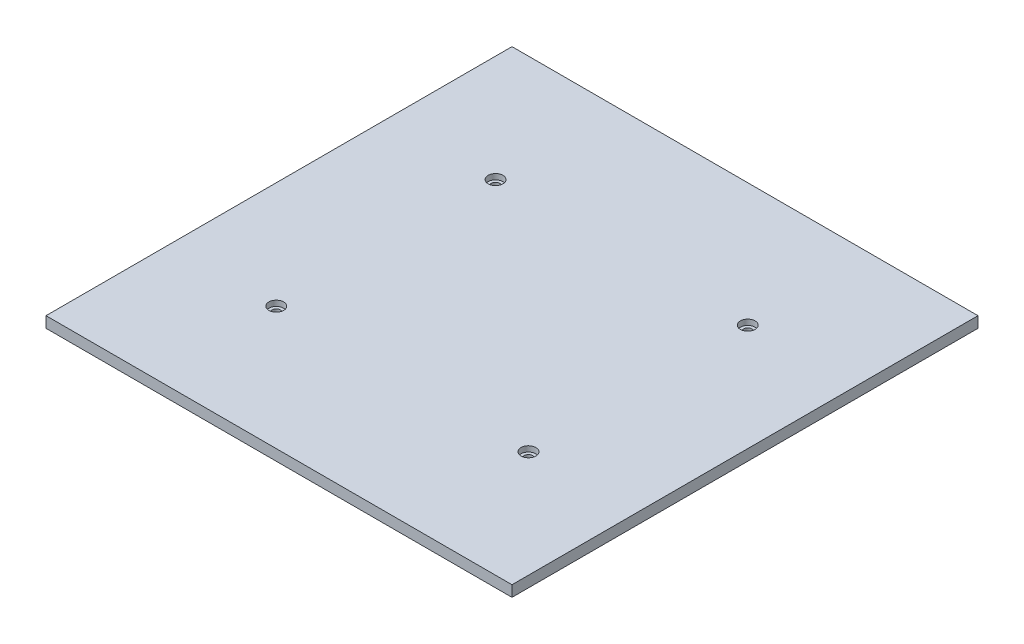
ISO-10303-21;
HEADER;
FILE_DESCRIPTION(('STEP AP214'),'2;1');
FILE_NAME('part.step','',(''),(''),'','','');
FILE_SCHEMA(('AUTOMOTIVE_DESIGN { 1 0 10303 214 1 1 1 1 }'));
ENDSEC;
DATA;
#1=APPLICATION_CONTEXT('core data for automotive mechanical design processes');
#2=APPLICATION_PROTOCOL_DEFINITION('international standard','automotive_design',2000,#1);
#3=PRODUCT_CONTEXT('',#1,'mechanical');
#4=PRODUCT('Part','Part','',(#3));
#5=PRODUCT_RELATED_PRODUCT_CATEGORY('part','',(#4));
#6=PRODUCT_DEFINITION_FORMATION('','',#4);
#7=PRODUCT_DEFINITION_CONTEXT('part definition',#1,'design');
#8=PRODUCT_DEFINITION('design','',#6,#7);
#9=PRODUCT_DEFINITION_SHAPE('','',#8);
#10=(LENGTH_UNIT() NAMED_UNIT(*) SI_UNIT(.MILLI.,.METRE.));
#11=(NAMED_UNIT(*) PLANE_ANGLE_UNIT() SI_UNIT($,.RADIAN.));
#12=(NAMED_UNIT(*) SI_UNIT($,.STERADIAN.) SOLID_ANGLE_UNIT());
#13=UNCERTAINTY_MEASURE_WITH_UNIT(LENGTH_MEASURE(1.E-05),#10,'distance_accuracy_value','');
#14=(GEOMETRIC_REPRESENTATION_CONTEXT(3) GLOBAL_UNCERTAINTY_ASSIGNED_CONTEXT((#13)) GLOBAL_UNIT_ASSIGNED_CONTEXT((#10,
#11,#12)) REPRESENTATION_CONTEXT('',''));
#15=CARTESIAN_POINT('',(0.,0.,0.));
#16=DIRECTION('',(0.,0.,1.));
#17=DIRECTION('',(1.,0.,0.));
#18=AXIS2_PLACEMENT_3D('',#15,#16,#17);
#19=CARTESIAN_POINT('',(-46.,-0.00100000000000013,40.));
#20=DIRECTION('',(0.,1.,0.));
#21=DIRECTION('',(0.,0.,1.));
#22=AXIS2_PLACEMENT_3D('',#19,#20,#21);
#23=CYLINDRICAL_SURFACE('',#22,1.6);
#24=CARTESIAN_POINT('',(-46.,0.,40.));
#25=DIRECTION('',(0.,-1.,0.));
#26=DIRECTION('',(0.,0.,-1.));
#27=AXIS2_PLACEMENT_3D('',#24,#25,#26);
#28=CIRCLE('',#27,1.6);
#29=CARTESIAN_POINT('',(-46.,0.,38.4));
#30=VERTEX_POINT('',#29);
#31=EDGE_CURVE('E106',#30,#30,#28,.F.);
#32=ORIENTED_EDGE('',*,*,#31,.F.);
#33=EDGE_LOOP('',(#32));
#34=FACE_BOUND('',#33,.T.);
#35=CARTESIAN_POINT('',(-46.,2.,40.));
#36=DIRECTION('',(0.,1.,0.));
#37=DIRECTION('',(0.,0.,1.));
#38=AXIS2_PLACEMENT_3D('',#35,#36,#37);
#39=CIRCLE('',#38,1.6);
#40=CARTESIAN_POINT('',(-46.,2.,41.6));
#41=VERTEX_POINT('',#40);
#42=EDGE_CURVE('E160',#41,#41,#39,.T.);
#43=ORIENTED_EDGE('',*,*,#42,.T.);
#44=EDGE_LOOP('',(#43));
#45=FACE_BOUND('',#44,.T.);
#46=ADVANCED_FACE('F39',(#34,#45),#23,.F.);
#47=CARTESIAN_POINT('',(46.,-0.00100000000000013,-40.));
#48=DIRECTION('',(0.,1.,0.));
#49=DIRECTION('',(0.,0.,1.));
#50=AXIS2_PLACEMENT_3D('',#47,#48,#49);
#51=CYLINDRICAL_SURFACE('',#50,1.6);
#52=CARTESIAN_POINT('',(46.,0.,-40.));
#53=DIRECTION('',(0.,-1.,0.));
#54=DIRECTION('',(0.,0.,-1.));
#55=AXIS2_PLACEMENT_3D('',#52,#53,#54);
#56=CIRCLE('',#55,1.6);
#57=CARTESIAN_POINT('',(46.,0.,-41.6));
#58=VERTEX_POINT('',#57);
#59=EDGE_CURVE('E124',#58,#58,#56,.F.);
#60=ORIENTED_EDGE('',*,*,#59,.F.);
#61=EDGE_LOOP('',(#60));
#62=FACE_BOUND('',#61,.T.);
#63=CARTESIAN_POINT('',(46.,2.,-40.));
#64=DIRECTION('',(0.,1.,0.));
#65=DIRECTION('',(0.,0.,1.));
#66=AXIS2_PLACEMENT_3D('',#63,#64,#65);
#67=CIRCLE('',#66,1.6);
#68=CARTESIAN_POINT('',(46.,2.,-38.4));
#69=VERTEX_POINT('',#68);
#70=EDGE_CURVE('E133',#69,#69,#67,.T.);
#71=ORIENTED_EDGE('',*,*,#70,.T.);
#72=EDGE_LOOP('',(#71));
#73=FACE_BOUND('',#72,.T.);
#74=ADVANCED_FACE('F182',(#62,#73),#51,.F.);
#75=CARTESIAN_POINT('',(0.,4.,0.));
#76=DIRECTION('',(0.,-1.,0.));
#77=DIRECTION('',(0.,0.,-1.));
#78=AXIS2_PLACEMENT_3D('',#75,#76,#77);
#79=PLANE('',#78);
#80=CARTESIAN_POINT('',(-46.,4.,-40.));
#81=DIRECTION('',(0.,1.,0.));
#82=DIRECTION('',(0.,0.,-1.));
#83=AXIS2_PLACEMENT_3D('',#80,#81,#82);
#84=CIRCLE('',#83,2.7);
#85=CARTESIAN_POINT('',(-46.,4.,-42.7));
#86=VERTEX_POINT('',#85);
#87=EDGE_CURVE('E150',#86,#86,#84,.T.);
#88=ORIENTED_EDGE('',*,*,#87,.F.);
#89=EDGE_LOOP('',(#88));
#90=FACE_BOUND('',#89,.T.);
#91=CARTESIAN_POINT('',(46.,4.,40.));
#92=DIRECTION('',(0.,1.,0.));
#93=DIRECTION('',(0.,0.,-1.));
#94=AXIS2_PLACEMENT_3D('',#91,#92,#93);
#95=CIRCLE('',#94,2.7);
#96=CARTESIAN_POINT('',(46.,4.,37.3));
#97=VERTEX_POINT('',#96);
#98=EDGE_CURVE('E139',#97,#97,#95,.T.);
#99=ORIENTED_EDGE('',*,*,#98,.F.);
#100=EDGE_LOOP('',(#99));
#101=FACE_BOUND('',#100,.T.);
#102=CARTESIAN_POINT('',(-46.,4.,40.));
#103=DIRECTION('',(0.,1.,0.));
#104=DIRECTION('',(0.,0.,1.));
#105=AXIS2_PLACEMENT_3D('',#102,#103,#104);
#106=CIRCLE('',#105,2.7);
#107=CARTESIAN_POINT('',(-46.,4.,42.7));
#108=VERTEX_POINT('',#107);
#109=EDGE_CURVE('E157',#108,#108,#106,.T.);
#110=ORIENTED_EDGE('',*,*,#109,.F.);
#111=EDGE_LOOP('',(#110));
#112=FACE_BOUND('',#111,.T.);
#113=CARTESIAN_POINT('',(46.,4.,-40.));
#114=DIRECTION('',(0.,1.,0.));
#115=DIRECTION('',(0.,0.,1.));
#116=AXIS2_PLACEMENT_3D('',#113,#114,#115);
#117=CIRCLE('',#116,2.7);
#118=CARTESIAN_POINT('',(46.,4.,-37.3));
#119=VERTEX_POINT('',#118);
#120=EDGE_CURVE('E130',#119,#119,#117,.T.);
#121=ORIENTED_EDGE('',*,*,#120,.F.);
#122=EDGE_LOOP('',(#121));
#123=FACE_BOUND('',#122,.T.);
#124=DIRECTION('',(0.,0.,-1.));
#125=VECTOR('',#124,1.);
#126=CARTESIAN_POINT('',(85.,4.,85.));
#127=LINE('',#126,#125);
#128=CARTESIAN_POINT('',(85.,4.,85.));
#129=VERTEX_POINT('',#128);
#130=CARTESIAN_POINT('',(85.,4.,-85.));
#131=VERTEX_POINT('',#130);
#132=EDGE_CURVE('E91',#129,#131,#127,.T.);
#133=ORIENTED_EDGE('',*,*,#132,.T.);
#134=DIRECTION('',(-1.,0.,0.));
#135=VECTOR('',#134,1.);
#136=CARTESIAN_POINT('',(-85.,4.,-85.));
#137=LINE('',#136,#135);
#138=CARTESIAN_POINT('',(-85.,4.,-85.));
#139=VERTEX_POINT('',#138);
#140=EDGE_CURVE('E86',#131,#139,#137,.T.);
#141=ORIENTED_EDGE('',*,*,#140,.T.);
#142=DIRECTION('',(0.,0.,1.));
#143=VECTOR('',#142,1.);
#144=CARTESIAN_POINT('',(-85.,4.,85.));
#145=LINE('',#144,#143);
#146=CARTESIAN_POINT('',(-85.,4.,85.));
#147=VERTEX_POINT('',#146);
#148=EDGE_CURVE('E89',#139,#147,#145,.T.);
#149=ORIENTED_EDGE('',*,*,#148,.T.);
#150=DIRECTION('',(1.,0.,0.));
#151=VECTOR('',#150,1.);
#152=CARTESIAN_POINT('',(-85.,4.,85.));
#153=LINE('',#152,#151);
#154=EDGE_CURVE('E56',#147,#129,#153,.T.);
#155=ORIENTED_EDGE('',*,*,#154,.T.);
#156=EDGE_LOOP('',(#133,#141,#149,#155));
#157=FACE_BOUND('',#156,.T.);
#158=ADVANCED_FACE('F87',(#90,#101,#112,#123,#157),#79,.F.);
#159=CARTESIAN_POINT('',(0.,0.,0.));
#160=DIRECTION('',(0.,-1.,0.));
#161=DIRECTION('',(0.,0.,-1.));
#162=AXIS2_PLACEMENT_3D('',#159,#160,#161);
#163=PLANE('',#162);
#164=CARTESIAN_POINT('',(46.,0.,40.));
#165=DIRECTION('',(0.,-1.,0.));
#166=DIRECTION('',(0.,0.,-1.));
#167=AXIS2_PLACEMENT_3D('',#164,#165,#166);
#168=CIRCLE('',#167,1.6);
#169=CARTESIAN_POINT('',(46.,0.,38.4));
#170=VERTEX_POINT('',#169);
#171=EDGE_CURVE('E121',#170,#170,#168,.T.);
#172=ORIENTED_EDGE('',*,*,#171,.F.);
#173=EDGE_LOOP('',(#172));
#174=FACE_BOUND('',#173,.T.);
#175=ORIENTED_EDGE('',*,*,#59,.T.);
#176=EDGE_LOOP('',(#175));
#177=FACE_BOUND('',#176,.T.);
#178=ORIENTED_EDGE('',*,*,#31,.T.);
#179=EDGE_LOOP('',(#178));
#180=FACE_BOUND('',#179,.T.);
#181=DIRECTION('',(0.,0.,-1.));
#182=VECTOR('',#181,1.);
#183=CARTESIAN_POINT('',(85.,0.,85.));
#184=LINE('',#183,#182);
#185=CARTESIAN_POINT('',(85.,0.,85.));
#186=VERTEX_POINT('',#185);
#187=CARTESIAN_POINT('',(85.,0.,-85.));
#188=VERTEX_POINT('',#187);
#189=EDGE_CURVE('E103',#186,#188,#184,.T.);
#190=ORIENTED_EDGE('',*,*,#189,.F.);
#191=DIRECTION('',(1.,0.,0.));
#192=VECTOR('',#191,1.);
#193=CARTESIAN_POINT('',(-85.,0.,85.));
#194=LINE('',#193,#192);
#195=CARTESIAN_POINT('',(-85.,0.,85.));
#196=VERTEX_POINT('',#195);
#197=EDGE_CURVE('E79',#196,#186,#194,.T.);
#198=ORIENTED_EDGE('',*,*,#197,.F.);
#199=DIRECTION('',(0.,0.,1.));
#200=VECTOR('',#199,1.);
#201=CARTESIAN_POINT('',(-85.,0.,85.));
#202=LINE('',#201,#200);
#203=CARTESIAN_POINT('',(-85.,0.,-85.));
#204=VERTEX_POINT('',#203);
#205=EDGE_CURVE('E73',#204,#196,#202,.T.);
#206=ORIENTED_EDGE('',*,*,#205,.F.);
#207=DIRECTION('',(-1.,0.,0.));
#208=VECTOR('',#207,1.);
#209=CARTESIAN_POINT('',(-85.,0.,-85.));
#210=LINE('',#209,#208);
#211=EDGE_CURVE('E95',#188,#204,#210,.T.);
#212=ORIENTED_EDGE('',*,*,#211,.F.);
#213=EDGE_LOOP('',(#190,#198,#206,#212));
#214=FACE_BOUND('',#213,.T.);
#215=CARTESIAN_POINT('',(-46.,0.,-40.));
#216=DIRECTION('',(0.,-1.,0.));
#217=DIRECTION('',(0.,0.,-1.));
#218=AXIS2_PLACEMENT_3D('',#215,#216,#217);
#219=CIRCLE('',#218,1.6);
#220=CARTESIAN_POINT('',(-46.,0.,-41.6));
#221=VERTEX_POINT('',#220);
#222=EDGE_CURVE('E120',#221,#221,#219,.T.);
#223=ORIENTED_EDGE('',*,*,#222,.F.);
#224=EDGE_LOOP('',(#223));
#225=FACE_BOUND('',#224,.T.);
#226=ADVANCED_FACE('F114',(#174,#177,#180,#214,#225),#163,.T.);
#227=CARTESIAN_POINT('',(85.,4.,85.));
#228=DIRECTION('',(-1.,0.,0.));
#229=DIRECTION('',(0.,0.,1.));
#230=AXIS2_PLACEMENT_3D('',#227,#228,#229);
#231=PLANE('',#230);
#232=ORIENTED_EDGE('',*,*,#189,.T.);
#233=DIRECTION('',(0.,-1.,0.));
#234=VECTOR('',#233,1.);
#235=CARTESIAN_POINT('',(85.,4.,-85.));
#236=LINE('',#235,#234);
#237=EDGE_CURVE('E11',#131,#188,#236,.T.);
#238=ORIENTED_EDGE('',*,*,#237,.F.);
#239=ORIENTED_EDGE('',*,*,#132,.F.);
#240=DIRECTION('',(0.,-1.,0.));
#241=VECTOR('',#240,1.);
#242=CARTESIAN_POINT('',(85.,4.,85.));
#243=LINE('',#242,#241);
#244=EDGE_CURVE('E99',#129,#186,#243,.T.);
#245=ORIENTED_EDGE('',*,*,#244,.T.);
#246=EDGE_LOOP('',(#232,#238,#239,#245));
#247=FACE_BOUND('',#246,.T.);
#248=ADVANCED_FACE('F41',(#247),#231,.F.);
#249=CARTESIAN_POINT('',(-85.,4.,-85.));
#250=DIRECTION('',(0.,0.,1.));
#251=DIRECTION('',(1.,0.,0.));
#252=AXIS2_PLACEMENT_3D('',#249,#250,#251);
#253=PLANE('',#252);
#254=ORIENTED_EDGE('',*,*,#211,.T.);
#255=DIRECTION('',(0.,-1.,0.));
#256=VECTOR('',#255,1.);
#257=CARTESIAN_POINT('',(-85.,4.,-85.));
#258=LINE('',#257,#256);
#259=EDGE_CURVE('E48',#139,#204,#258,.T.);
#260=ORIENTED_EDGE('',*,*,#259,.F.);
#261=ORIENTED_EDGE('',*,*,#140,.F.);
#262=ORIENTED_EDGE('',*,*,#237,.T.);
#263=EDGE_LOOP('',(#254,#260,#261,#262));
#264=FACE_BOUND('',#263,.T.);
#265=ADVANCED_FACE('F94',(#264),#253,.F.);
#266=CARTESIAN_POINT('',(-85.,4.,85.));
#267=DIRECTION('',(1.,0.,0.));
#268=DIRECTION('',(0.,0.,-1.));
#269=AXIS2_PLACEMENT_3D('',#266,#267,#268);
#270=PLANE('',#269);
#271=ORIENTED_EDGE('',*,*,#205,.T.);
#272=DIRECTION('',(0.,-1.,0.));
#273=VECTOR('',#272,1.);
#274=CARTESIAN_POINT('',(-85.,4.,85.));
#275=LINE('',#274,#273);
#276=EDGE_CURVE('E96',#147,#196,#275,.T.);
#277=ORIENTED_EDGE('',*,*,#276,.F.);
#278=ORIENTED_EDGE('',*,*,#148,.F.);
#279=ORIENTED_EDGE('',*,*,#259,.T.);
#280=EDGE_LOOP('',(#271,#277,#278,#279));
#281=FACE_BOUND('',#280,.T.);
#282=ADVANCED_FACE('F97',(#281),#270,.F.);
#283=CARTESIAN_POINT('',(-85.,4.,85.));
#284=DIRECTION('',(0.,0.,-1.));
#285=DIRECTION('',(-1.,0.,0.));
#286=AXIS2_PLACEMENT_3D('',#283,#284,#285);
#287=PLANE('',#286);
#288=ORIENTED_EDGE('',*,*,#197,.T.);
#289=ORIENTED_EDGE('',*,*,#244,.F.);
#290=ORIENTED_EDGE('',*,*,#154,.F.);
#291=ORIENTED_EDGE('',*,*,#276,.T.);
#292=EDGE_LOOP('',(#288,#289,#290,#291));
#293=FACE_BOUND('',#292,.T.);
#294=ADVANCED_FACE('F111',(#293),#287,.F.);
#295=CARTESIAN_POINT('',(46.,-0.00100000000000013,40.));
#296=DIRECTION('',(0.,1.,0.));
#297=DIRECTION('',(0.,0.,1.));
#298=AXIS2_PLACEMENT_3D('',#295,#296,#297);
#299=CYLINDRICAL_SURFACE('',#298,1.6);
#300=CARTESIAN_POINT('',(46.,2.,40.));
#301=DIRECTION('',(0.,1.,0.));
#302=DIRECTION('',(0.,0.,-1.));
#303=AXIS2_PLACEMENT_3D('',#300,#301,#302);
#304=CIRCLE('',#303,1.6);
#305=CARTESIAN_POINT('',(46.,2.,38.4));
#306=VERTEX_POINT('',#305);
#307=EDGE_CURVE('E143',#306,#306,#304,.T.);
#308=ORIENTED_EDGE('',*,*,#307,.T.);
#309=EDGE_LOOP('',(#308));
#310=FACE_BOUND('',#309,.T.);
#311=ORIENTED_EDGE('',*,*,#171,.T.);
#312=EDGE_LOOP('',(#311));
#313=FACE_BOUND('',#312,.T.);
#314=ADVANCED_FACE('F213',(#310,#313),#299,.F.);
#315=CARTESIAN_POINT('',(-46.,-0.00100000000000013,-40.));
#316=DIRECTION('',(0.,1.,0.));
#317=DIRECTION('',(0.,0.,1.));
#318=AXIS2_PLACEMENT_3D('',#315,#316,#317);
#319=CYLINDRICAL_SURFACE('',#318,1.6);
#320=CARTESIAN_POINT('',(-46.,2.,-40.));
#321=DIRECTION('',(0.,1.,0.));
#322=DIRECTION('',(0.,0.,-1.));
#323=AXIS2_PLACEMENT_3D('',#320,#321,#322);
#324=CIRCLE('',#323,1.6);
#325=CARTESIAN_POINT('',(-46.,2.,-41.6));
#326=VERTEX_POINT('',#325);
#327=EDGE_CURVE('E146',#326,#326,#324,.T.);
#328=ORIENTED_EDGE('',*,*,#327,.T.);
#329=EDGE_LOOP('',(#328));
#330=FACE_BOUND('',#329,.T.);
#331=ORIENTED_EDGE('',*,*,#222,.T.);
#332=EDGE_LOOP('',(#331));
#333=FACE_BOUND('',#332,.T.);
#334=ADVANCED_FACE('F265',(#330,#333),#319,.F.);
#335=CARTESIAN_POINT('',(-46.,2.,-40.));
#336=DIRECTION('',(0.,1.,0.));
#337=DIRECTION('',(0.,0.,1.));
#338=AXIS2_PLACEMENT_3D('',#335,#336,#337);
#339=CYLINDRICAL_SURFACE('',#338,2.7);
#340=CARTESIAN_POINT('',(-46.,2.,-40.));
#341=DIRECTION('',(0.,1.,0.));
#342=DIRECTION('',(0.,0.,-1.));
#343=AXIS2_PLACEMENT_3D('',#340,#341,#342);
#344=CIRCLE('',#343,2.7);
#345=CARTESIAN_POINT('',(-46.,2.,-42.7));
#346=VERTEX_POINT('',#345);
#347=EDGE_CURVE('E138',#346,#346,#344,.T.);
#348=ORIENTED_EDGE('',*,*,#347,.F.);
#349=EDGE_LOOP('',(#348));
#350=FACE_BOUND('',#349,.T.);
#351=ORIENTED_EDGE('',*,*,#87,.T.);
#352=EDGE_LOOP('',(#351));
#353=FACE_BOUND('',#352,.T.);
#354=ADVANCED_FACE('F274',(#350,#353),#339,.F.);
#355=CARTESIAN_POINT('',(-46.,2.,-40.));
#356=DIRECTION('',(0.,-1.,0.));
#357=DIRECTION('',(0.,0.,-1.));
#358=AXIS2_PLACEMENT_3D('',#355,#356,#357);
#359=PLANE('',#358);
#360=ORIENTED_EDGE('',*,*,#327,.F.);
#361=EDGE_LOOP('',(#360));
#362=FACE_BOUND('',#361,.T.);
#363=ORIENTED_EDGE('',*,*,#347,.T.);
#364=EDGE_LOOP('',(#363));
#365=FACE_BOUND('',#364,.T.);
#366=ADVANCED_FACE('F292',(#362,#365),#359,.F.);
#367=CARTESIAN_POINT('',(46.,2.,40.));
#368=DIRECTION('',(0.,1.,0.));
#369=DIRECTION('',(0.,0.,1.));
#370=AXIS2_PLACEMENT_3D('',#367,#368,#369);
#371=CYLINDRICAL_SURFACE('',#370,2.7);
#372=CARTESIAN_POINT('',(46.,2.,40.));
#373=DIRECTION('',(0.,1.,0.));
#374=DIRECTION('',(0.,0.,-1.));
#375=AXIS2_PLACEMENT_3D('',#372,#373,#374);
#376=CIRCLE('',#375,2.7);
#377=CARTESIAN_POINT('',(46.,2.,37.3));
#378=VERTEX_POINT('',#377);
#379=EDGE_CURVE('E142',#378,#378,#376,.T.);
#380=ORIENTED_EDGE('',*,*,#379,.F.);
#381=EDGE_LOOP('',(#380));
#382=FACE_BOUND('',#381,.T.);
#383=ORIENTED_EDGE('',*,*,#98,.T.);
#384=EDGE_LOOP('',(#383));
#385=FACE_BOUND('',#384,.T.);
#386=ADVANCED_FACE('F198',(#382,#385),#371,.F.);
#387=CARTESIAN_POINT('',(46.,2.,40.));
#388=DIRECTION('',(0.,-1.,0.));
#389=DIRECTION('',(0.,0.,-1.));
#390=AXIS2_PLACEMENT_3D('',#387,#388,#389);
#391=PLANE('',#390);
#392=ORIENTED_EDGE('',*,*,#307,.F.);
#393=EDGE_LOOP('',(#392));
#394=FACE_BOUND('',#393,.T.);
#395=ORIENTED_EDGE('',*,*,#379,.T.);
#396=EDGE_LOOP('',(#395));
#397=FACE_BOUND('',#396,.T.);
#398=ADVANCED_FACE('F189',(#394,#397),#391,.F.);
#399=CARTESIAN_POINT('',(46.,2.,-40.));
#400=DIRECTION('',(0.,1.,0.));
#401=DIRECTION('',(0.,0.,1.));
#402=AXIS2_PLACEMENT_3D('',#399,#400,#401);
#403=CYLINDRICAL_SURFACE('',#402,2.7);
#404=CARTESIAN_POINT('',(46.,2.,-40.));
#405=DIRECTION('',(0.,1.,0.));
#406=DIRECTION('',(0.,0.,1.));
#407=AXIS2_PLACEMENT_3D('',#404,#405,#406);
#408=CIRCLE('',#407,2.7);
#409=CARTESIAN_POINT('',(46.,2.,-37.3));
#410=VERTEX_POINT('',#409);
#411=EDGE_CURVE('E129',#410,#410,#408,.T.);
#412=ORIENTED_EDGE('',*,*,#411,.F.);
#413=EDGE_LOOP('',(#412));
#414=FACE_BOUND('',#413,.T.);
#415=ORIENTED_EDGE('',*,*,#120,.T.);
#416=EDGE_LOOP('',(#415));
#417=FACE_BOUND('',#416,.T.);
#418=ADVANCED_FACE('F187',(#414,#417),#403,.F.);
#419=CARTESIAN_POINT('',(46.,2.,-40.));
#420=DIRECTION('',(0.,1.,0.));
#421=DIRECTION('',(0.,0.,1.));
#422=AXIS2_PLACEMENT_3D('',#419,#420,#421);
#423=PLANE('',#422);
#424=ORIENTED_EDGE('',*,*,#70,.F.);
#425=EDGE_LOOP('',(#424));
#426=FACE_BOUND('',#425,.T.);
#427=ORIENTED_EDGE('',*,*,#411,.T.);
#428=EDGE_LOOP('',(#427));
#429=FACE_BOUND('',#428,.T.);
#430=ADVANCED_FACE('F176',(#426,#429),#423,.T.);
#431=CARTESIAN_POINT('',(-46.,2.,40.));
#432=DIRECTION('',(0.,1.,0.));
#433=DIRECTION('',(0.,0.,1.));
#434=AXIS2_PLACEMENT_3D('',#431,#432,#433);
#435=CYLINDRICAL_SURFACE('',#434,2.7);
#436=CARTESIAN_POINT('',(-46.,2.,40.));
#437=DIRECTION('',(0.,1.,0.));
#438=DIRECTION('',(0.,0.,1.));
#439=AXIS2_PLACEMENT_3D('',#436,#437,#438);
#440=CIRCLE('',#439,2.7);
#441=CARTESIAN_POINT('',(-46.,2.,42.7));
#442=VERTEX_POINT('',#441);
#443=EDGE_CURVE('E149',#442,#442,#440,.T.);
#444=ORIENTED_EDGE('',*,*,#443,.F.);
#445=EDGE_LOOP('',(#444));
#446=FACE_BOUND('',#445,.T.);
#447=ORIENTED_EDGE('',*,*,#109,.T.);
#448=EDGE_LOOP('',(#447));
#449=FACE_BOUND('',#448,.T.);
#450=ADVANCED_FACE('F170',(#446,#449),#435,.F.);
#451=CARTESIAN_POINT('',(-46.,2.,40.));
#452=DIRECTION('',(0.,1.,0.));
#453=DIRECTION('',(0.,0.,1.));
#454=AXIS2_PLACEMENT_3D('',#451,#452,#453);
#455=PLANE('',#454);
#456=ORIENTED_EDGE('',*,*,#42,.F.);
#457=EDGE_LOOP('',(#456));
#458=FACE_BOUND('',#457,.T.);
#459=ORIENTED_EDGE('',*,*,#443,.T.);
#460=EDGE_LOOP('',(#459));
#461=FACE_BOUND('',#460,.T.);
#462=ADVANCED_FACE('F167',(#458,#461),#455,.T.);
#463=CLOSED_SHELL('',(#46,#74,#158,#226,#248,#265,#282,#294,#314,#334,#354,#366,#386,#398,#418,
#430,#450,#462));
#464=MANIFOLD_SOLID_BREP('B2',#463);
#465=ADVANCED_BREP_SHAPE_REPRESENTATION('',(#18,#464),#14);
#466=SHAPE_DEFINITION_REPRESENTATION(#9,#465);
ENDSEC;
END-ISO-10303-21;
